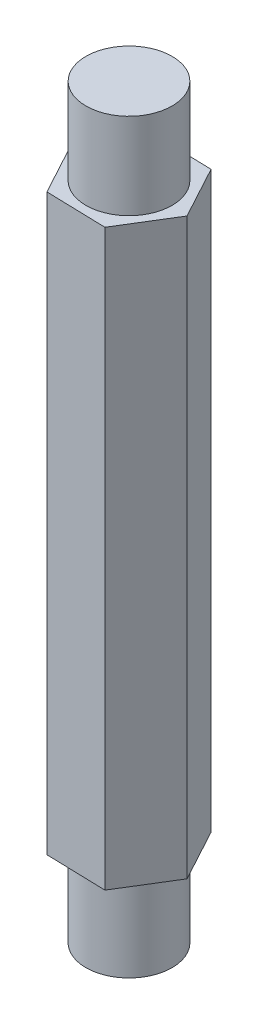
ISO-10303-21;
HEADER;
FILE_DESCRIPTION(('STEP AP214'),'2;1');
FILE_NAME('part.step','',(''),(''),'','','');
FILE_SCHEMA(('AUTOMOTIVE_DESIGN { 1 0 10303 214 1 1 1 1 }'));
ENDSEC;
DATA;
#1=APPLICATION_CONTEXT('core data for automotive mechanical design processes');
#2=APPLICATION_PROTOCOL_DEFINITION('international standard','automotive_design',2000,#1);
#3=PRODUCT_CONTEXT('',#1,'mechanical');
#4=PRODUCT('Part','Part','',(#3));
#5=PRODUCT_RELATED_PRODUCT_CATEGORY('part','',(#4));
#6=PRODUCT_DEFINITION_FORMATION('','',#4);
#7=PRODUCT_DEFINITION_CONTEXT('part definition',#1,'design');
#8=PRODUCT_DEFINITION('design','',#6,#7);
#9=PRODUCT_DEFINITION_SHAPE('','',#8);
#10=(LENGTH_UNIT() NAMED_UNIT(*) SI_UNIT(.MILLI.,.METRE.));
#11=(NAMED_UNIT(*) PLANE_ANGLE_UNIT() SI_UNIT($,.RADIAN.));
#12=(NAMED_UNIT(*) SI_UNIT($,.STERADIAN.) SOLID_ANGLE_UNIT());
#13=UNCERTAINTY_MEASURE_WITH_UNIT(LENGTH_MEASURE(1.E-05),#10,'distance_accuracy_value','');
#14=(GEOMETRIC_REPRESENTATION_CONTEXT(3) GLOBAL_UNCERTAINTY_ASSIGNED_CONTEXT((#13)) GLOBAL_UNIT_ASSIGNED_CONTEXT((#10,
#11,#12)) REPRESENTATION_CONTEXT('',''));
#15=CARTESIAN_POINT('',(0.,0.,0.));
#16=DIRECTION('',(0.,0.,1.));
#17=DIRECTION('',(1.,0.,0.));
#18=AXIS2_PLACEMENT_3D('',#15,#16,#17);
#19=CARTESIAN_POINT('',(0.,23.,0.));
#20=DIRECTION('',(0.,1.,0.));
#21=DIRECTION('',(0.,0.,1.));
#22=AXIS2_PLACEMENT_3D('',#19,#20,#21);
#23=PLANE('',#22);
#24=DIRECTION('',(-0.999619051100166,0.,-0.0275998673475779));
#25=VECTOR('',#24,1.);
#26=CARTESIAN_POINT('',(1.08851435205721,23.,-1.7706316684634));
#27=LINE('',#26,#25);
#28=CARTESIAN_POINT('',(1.08851435205721,23.,-1.7706316684634));
#29=VERTEX_POINT('',#28);
#30=CARTESIAN_POINT('',(-0.989154829605925,23.,-1.8279969154972));
#31=VERTEX_POINT('',#30);
#32=EDGE_CURVE('E130',#29,#31,#27,.T.);
#33=ORIENTED_EDGE('',*,*,#32,.T.);
#34=DIRECTION('',(-0.523711711814166,0.,0.85189555868585));
#35=VECTOR('',#34,1.);
#36=CARTESIAN_POINT('',(-0.989154829605925,23.,-1.8279969154972));
#37=LINE('',#36,#35);
#38=CARTESIAN_POINT('',(-2.07766918166313,23.,-0.0573652470337996));
#39=VERTEX_POINT('',#38);
#40=EDGE_CURVE('E88',#31,#39,#37,.T.);
#41=ORIENTED_EDGE('',*,*,#40,.T.);
#42=DIRECTION('',(0.475907339286,0.,0.879495426033427));
#43=VECTOR('',#42,1.);
#44=CARTESIAN_POINT('',(-2.07766918166313,23.,-0.0573652470337996));
#45=LINE('',#44,#43);
#46=CARTESIAN_POINT('',(-1.0885143520572,23.,1.7706316684634));
#47=VERTEX_POINT('',#46);
#48=EDGE_CURVE('E101',#39,#47,#45,.T.);
#49=ORIENTED_EDGE('',*,*,#48,.T.);
#50=DIRECTION('',(0.999619051100166,0.,0.0275998673475778));
#51=VECTOR('',#50,1.);
#52=CARTESIAN_POINT('',(-1.0885143520572,23.,1.7706316684634));
#53=LINE('',#52,#51);
#54=CARTESIAN_POINT('',(0.989154829605927,23.,1.8279969154972));
#55=VERTEX_POINT('',#54);
#56=EDGE_CURVE('E95',#47,#55,#53,.T.);
#57=ORIENTED_EDGE('',*,*,#56,.T.);
#58=DIRECTION('',(0.523711711814166,0.,-0.85189555868585));
#59=VECTOR('',#58,1.);
#60=CARTESIAN_POINT('',(0.989154829605927,23.,1.8279969154972));
#61=LINE('',#60,#59);
#62=CARTESIAN_POINT('',(2.07766918166313,23.,0.0573652470337994));
#63=VERTEX_POINT('',#62);
#64=EDGE_CURVE('E99',#55,#63,#61,.T.);
#65=ORIENTED_EDGE('',*,*,#64,.T.);
#66=DIRECTION('',(-0.475907339286,0.,-0.879495426033427));
#67=VECTOR('',#66,1.);
#68=CARTESIAN_POINT('',(2.07766918166313,23.,0.0573652470337994));
#69=LINE('',#68,#67);
#70=EDGE_CURVE('E50',#63,#29,#69,.T.);
#71=ORIENTED_EDGE('',*,*,#70,.T.);
#72=EDGE_LOOP('',(#33,#41,#49,#57,#65,#71));
#73=FACE_BOUND('',#72,.T.);
#74=CARTESIAN_POINT('',(0.,23.,0.));
#75=DIRECTION('',(0.,1.,0.));
#76=DIRECTION('',(0.,0.,1.));
#77=AXIS2_PLACEMENT_3D('',#74,#75,#76);
#78=CIRCLE('',#77,1.5);
#79=CARTESIAN_POINT('',(0.,23.,1.5));
#80=VERTEX_POINT('',#79);
#81=EDGE_CURVE('E187',#80,#80,#78,.T.);
#82=ORIENTED_EDGE('',*,*,#81,.F.);
#83=EDGE_LOOP('',(#82));
#84=FACE_BOUND('',#83,.T.);
#85=ADVANCED_FACE('F33',(#73,#84),#23,.T.);
#86=CARTESIAN_POINT('',(0.,3.,0.));
#87=DIRECTION('',(0.,-1.,0.));
#88=DIRECTION('',(0.,0.,-1.));
#89=AXIS2_PLACEMENT_3D('',#86,#87,#88);
#90=CYLINDRICAL_SURFACE('',#89,1.5);
#91=CARTESIAN_POINT('',(0.,3.,0.));
#92=DIRECTION('',(0.,1.,0.));
#93=DIRECTION('',(0.,0.,1.));
#94=AXIS2_PLACEMENT_3D('',#91,#92,#93);
#95=CIRCLE('',#94,1.5);
#96=CARTESIAN_POINT('',(0.,3.,1.5));
#97=VERTEX_POINT('',#96);
#98=EDGE_CURVE('E11',#97,#97,#95,.T.);
#99=ORIENTED_EDGE('',*,*,#98,.F.);
#100=EDGE_LOOP('',(#99));
#101=FACE_BOUND('',#100,.T.);
#102=CARTESIAN_POINT('',(0.,0.,0.));
#103=DIRECTION('',(0.,1.,0.));
#104=DIRECTION('',(0.,0.,1.));
#105=AXIS2_PLACEMENT_3D('',#102,#103,#104);
#106=CIRCLE('',#105,1.5);
#107=CARTESIAN_POINT('',(0.,0.,1.5));
#108=VERTEX_POINT('',#107);
#109=EDGE_CURVE('E37',#108,#108,#106,.T.);
#110=ORIENTED_EDGE('',*,*,#109,.T.);
#111=EDGE_LOOP('',(#110));
#112=FACE_BOUND('',#111,.T.);
#113=ADVANCED_FACE('F35',(#101,#112),#90,.T.);
#114=CARTESIAN_POINT('',(0.,0.,0.));
#115=DIRECTION('',(0.,1.,0.));
#116=DIRECTION('',(0.,0.,1.));
#117=AXIS2_PLACEMENT_3D('',#114,#115,#116);
#118=PLANE('',#117);
#119=ORIENTED_EDGE('',*,*,#109,.F.);
#120=EDGE_LOOP('',(#119));
#121=FACE_BOUND('',#120,.T.);
#122=ADVANCED_FACE('F143',(#121),#118,.F.);
#123=CARTESIAN_POINT('',(0.,3.,0.));
#124=DIRECTION('',(0.,1.,0.));
#125=DIRECTION('',(0.,0.,1.));
#126=AXIS2_PLACEMENT_3D('',#123,#124,#125);
#127=PLANE('',#126);
#128=DIRECTION('',(-0.999619051100166,0.,-0.0275998673475779));
#129=VECTOR('',#128,1.);
#130=CARTESIAN_POINT('',(1.08851435205721,3.,-1.7706316684634));
#131=LINE('',#130,#129);
#132=CARTESIAN_POINT('',(1.08851435205721,3.,-1.7706316684634));
#133=VERTEX_POINT('',#132);
#134=CARTESIAN_POINT('',(-0.989154829605925,3.,-1.8279969154972));
#135=VERTEX_POINT('',#134);
#136=EDGE_CURVE('E119',#133,#135,#131,.T.);
#137=ORIENTED_EDGE('',*,*,#136,.F.);
#138=DIRECTION('',(-0.475907339286,0.,-0.879495426033427));
#139=VECTOR('',#138,1.);
#140=CARTESIAN_POINT('',(2.07766918166313,3.,0.0573652470337994));
#141=LINE('',#140,#139);
#142=CARTESIAN_POINT('',(2.07766918166313,3.,0.0573652470337994));
#143=VERTEX_POINT('',#142);
#144=EDGE_CURVE('E79',#143,#133,#141,.T.);
#145=ORIENTED_EDGE('',*,*,#144,.F.);
#146=DIRECTION('',(0.523711711814166,0.,-0.85189555868585));
#147=VECTOR('',#146,1.);
#148=CARTESIAN_POINT('',(0.989154829605927,3.,1.8279969154972));
#149=LINE('',#148,#147);
#150=CARTESIAN_POINT('',(0.989154829605927,3.,1.8279969154972));
#151=VERTEX_POINT('',#150);
#152=EDGE_CURVE('E73',#151,#143,#149,.T.);
#153=ORIENTED_EDGE('',*,*,#152,.F.);
#154=DIRECTION('',(0.999619051100166,0.,0.0275998673475778));
#155=VECTOR('',#154,1.);
#156=CARTESIAN_POINT('',(-1.0885143520572,3.,1.7706316684634));
#157=LINE('',#156,#155);
#158=CARTESIAN_POINT('',(-1.0885143520572,3.,1.7706316684634));
#159=VERTEX_POINT('',#158);
#160=EDGE_CURVE('E109',#159,#151,#157,.T.);
#161=ORIENTED_EDGE('',*,*,#160,.F.);
#162=DIRECTION('',(0.475907339286,0.,0.879495426033427));
#163=VECTOR('',#162,1.);
#164=CARTESIAN_POINT('',(-2.07766918166313,3.,-0.0573652470337996));
#165=LINE('',#164,#163);
#166=CARTESIAN_POINT('',(-2.07766918166313,3.,-0.0573652470337996));
#167=VERTEX_POINT('',#166);
#168=EDGE_CURVE('E125',#167,#159,#165,.T.);
#169=ORIENTED_EDGE('',*,*,#168,.F.);
#170=DIRECTION('',(-0.523711711814166,0.,0.85189555868585));
#171=VECTOR('',#170,1.);
#172=CARTESIAN_POINT('',(-0.989154829605925,3.,-1.8279969154972));
#173=LINE('',#172,#171);
#174=EDGE_CURVE('E122',#135,#167,#173,.T.);
#175=ORIENTED_EDGE('',*,*,#174,.F.);
#176=EDGE_LOOP('',(#137,#145,#153,#161,#169,#175));
#177=FACE_BOUND('',#176,.T.);
#178=ORIENTED_EDGE('',*,*,#98,.T.);
#179=EDGE_LOOP('',(#178));
#180=FACE_BOUND('',#179,.T.);
#181=ADVANCED_FACE('F145',(#177,#180),#127,.F.);
#182=CARTESIAN_POINT('',(1.08851435205721,23.,-1.7706316684634));
#183=DIRECTION('',(-0.0275998673475779,0.,0.999619051100166));
#184=DIRECTION('',(0.999619051100166,0.,0.0275998673475779));
#185=AXIS2_PLACEMENT_3D('',#182,#183,#184);
#186=PLANE('',#185);
#187=ORIENTED_EDGE('',*,*,#136,.T.);
#188=DIRECTION('',(0.,-1.,0.));
#189=VECTOR('',#188,1.);
#190=CARTESIAN_POINT('',(-0.989154829605925,23.,-1.8279969154972));
#191=LINE('',#190,#189);
#192=EDGE_CURVE('E137',#31,#135,#191,.T.);
#193=ORIENTED_EDGE('',*,*,#192,.F.);
#194=ORIENTED_EDGE('',*,*,#32,.F.);
#195=DIRECTION('',(0.,-1.,0.));
#196=VECTOR('',#195,1.);
#197=CARTESIAN_POINT('',(1.08851435205721,23.,-1.7706316684634));
#198=LINE('',#197,#196);
#199=EDGE_CURVE('E115',#29,#133,#198,.T.);
#200=ORIENTED_EDGE('',*,*,#199,.T.);
#201=EDGE_LOOP('',(#187,#193,#194,#200));
#202=FACE_BOUND('',#201,.T.);
#203=ADVANCED_FACE('F150',(#202),#186,.F.);
#204=CARTESIAN_POINT('',(-0.989154829605925,23.,-1.8279969154972));
#205=DIRECTION('',(0.85189555868585,0.,0.523711711814166));
#206=DIRECTION('',(0.523711711814166,0.,-0.85189555868585));
#207=AXIS2_PLACEMENT_3D('',#204,#205,#206);
#208=PLANE('',#207);
#209=ORIENTED_EDGE('',*,*,#174,.T.);
#210=DIRECTION('',(0.,-1.,0.));
#211=VECTOR('',#210,1.);
#212=CARTESIAN_POINT('',(-2.07766918166313,23.,-0.0573652470337996));
#213=LINE('',#212,#211);
#214=EDGE_CURVE('E134',#39,#167,#213,.T.);
#215=ORIENTED_EDGE('',*,*,#214,.F.);
#216=ORIENTED_EDGE('',*,*,#40,.F.);
#217=ORIENTED_EDGE('',*,*,#192,.T.);
#218=EDGE_LOOP('',(#209,#215,#216,#217));
#219=FACE_BOUND('',#218,.T.);
#220=ADVANCED_FACE('F173',(#219),#208,.F.);
#221=CARTESIAN_POINT('',(-2.07766918166313,23.,-0.0573652470337996));
#222=DIRECTION('',(0.879495426033427,0.,-0.475907339286));
#223=DIRECTION('',(-0.475907339286,0.,-0.879495426033428));
#224=AXIS2_PLACEMENT_3D('',#221,#222,#223);
#225=PLANE('',#224);
#226=ORIENTED_EDGE('',*,*,#168,.T.);
#227=DIRECTION('',(0.,-1.,0.));
#228=VECTOR('',#227,1.);
#229=CARTESIAN_POINT('',(-1.0885143520572,23.,1.7706316684634));
#230=LINE('',#229,#228);
#231=EDGE_CURVE('E110',#47,#159,#230,.T.);
#232=ORIENTED_EDGE('',*,*,#231,.F.);
#233=ORIENTED_EDGE('',*,*,#48,.F.);
#234=ORIENTED_EDGE('',*,*,#214,.T.);
#235=EDGE_LOOP('',(#226,#232,#233,#234));
#236=FACE_BOUND('',#235,.T.);
#237=ADVANCED_FACE('F170',(#236),#225,.F.);
#238=CARTESIAN_POINT('',(-1.0885143520572,23.,1.7706316684634));
#239=DIRECTION('',(0.0275998673475778,0.,-0.999619051100166));
#240=DIRECTION('',(-0.999619051100166,0.,-0.0275998673475778));
#241=AXIS2_PLACEMENT_3D('',#238,#239,#240);
#242=PLANE('',#241);
#243=ORIENTED_EDGE('',*,*,#160,.T.);
#244=DIRECTION('',(0.,-1.,0.));
#245=VECTOR('',#244,1.);
#246=CARTESIAN_POINT('',(0.989154829605927,23.,1.8279969154972));
#247=LINE('',#246,#245);
#248=EDGE_CURVE('E106',#55,#151,#247,.T.);
#249=ORIENTED_EDGE('',*,*,#248,.F.);
#250=ORIENTED_EDGE('',*,*,#56,.F.);
#251=ORIENTED_EDGE('',*,*,#231,.T.);
#252=EDGE_LOOP('',(#243,#249,#250,#251));
#253=FACE_BOUND('',#252,.T.);
#254=ADVANCED_FACE('F107',(#253),#242,.F.);
#255=CARTESIAN_POINT('',(0.989154829605927,23.,1.8279969154972));
#256=DIRECTION('',(-0.85189555868585,0.,-0.523711711814166));
#257=DIRECTION('',(-0.523711711814166,0.,0.85189555868585));
#258=AXIS2_PLACEMENT_3D('',#255,#256,#257);
#259=PLANE('',#258);
#260=ORIENTED_EDGE('',*,*,#152,.T.);
#261=DIRECTION('',(0.,-1.,0.));
#262=VECTOR('',#261,1.);
#263=CARTESIAN_POINT('',(2.07766918166313,23.,0.0573652470337994));
#264=LINE('',#263,#262);
#265=EDGE_CURVE('E111',#63,#143,#264,.T.);
#266=ORIENTED_EDGE('',*,*,#265,.F.);
#267=ORIENTED_EDGE('',*,*,#64,.F.);
#268=ORIENTED_EDGE('',*,*,#248,.T.);
#269=EDGE_LOOP('',(#260,#266,#267,#268));
#270=FACE_BOUND('',#269,.T.);
#271=ADVANCED_FACE('F113',(#270),#259,.F.);
#272=CARTESIAN_POINT('',(2.07766918166313,23.,0.0573652470337994));
#273=DIRECTION('',(-0.879495426033427,0.,0.475907339286));
#274=DIRECTION('',(0.475907339286,0.,0.879495426033428));
#275=AXIS2_PLACEMENT_3D('',#272,#273,#274);
#276=PLANE('',#275);
#277=ORIENTED_EDGE('',*,*,#144,.T.);
#278=ORIENTED_EDGE('',*,*,#199,.F.);
#279=ORIENTED_EDGE('',*,*,#70,.F.);
#280=ORIENTED_EDGE('',*,*,#265,.T.);
#281=EDGE_LOOP('',(#277,#278,#279,#280));
#282=FACE_BOUND('',#281,.T.);
#283=ADVANCED_FACE('F163',(#282),#276,.F.);
#284=CARTESIAN_POINT('',(0.,26.,0.));
#285=DIRECTION('',(0.,-1.,0.));
#286=DIRECTION('',(0.,0.,-1.));
#287=AXIS2_PLACEMENT_3D('',#284,#285,#286);
#288=CYLINDRICAL_SURFACE('',#287,1.5);
#289=CARTESIAN_POINT('',(0.,26.,0.));
#290=DIRECTION('',(0.,1.,0.));
#291=DIRECTION('',(0.,0.,1.));
#292=AXIS2_PLACEMENT_3D('',#289,#290,#291);
#293=CIRCLE('',#292,1.5);
#294=CARTESIAN_POINT('',(0.,26.,1.5));
#295=VERTEX_POINT('',#294);
#296=EDGE_CURVE('E123',#295,#295,#293,.T.);
#297=ORIENTED_EDGE('',*,*,#296,.F.);
#298=EDGE_LOOP('',(#297));
#299=FACE_BOUND('',#298,.T.);
#300=ORIENTED_EDGE('',*,*,#81,.T.);
#301=EDGE_LOOP('',(#300));
#302=FACE_BOUND('',#301,.T.);
#303=ADVANCED_FACE('F160',(#299,#302),#288,.T.);
#304=CARTESIAN_POINT('',(0.,26.,0.));
#305=DIRECTION('',(0.,1.,0.));
#306=DIRECTION('',(0.,0.,1.));
#307=AXIS2_PLACEMENT_3D('',#304,#305,#306);
#308=PLANE('',#307);
#309=ORIENTED_EDGE('',*,*,#296,.T.);
#310=EDGE_LOOP('',(#309));
#311=FACE_BOUND('',#310,.T.);
#312=ADVANCED_FACE('F193',(#311),#308,.T.);
#313=CLOSED_SHELL('',(#85,#113,#122,#181,#203,#220,#237,#254,#271,#283,#303,#312));
#314=MANIFOLD_SOLID_BREP('B2',#313);
#315=ADVANCED_BREP_SHAPE_REPRESENTATION('',(#18,#314),#14);
#316=SHAPE_DEFINITION_REPRESENTATION(#9,#315);
ENDSEC;
END-ISO-10303-21;
